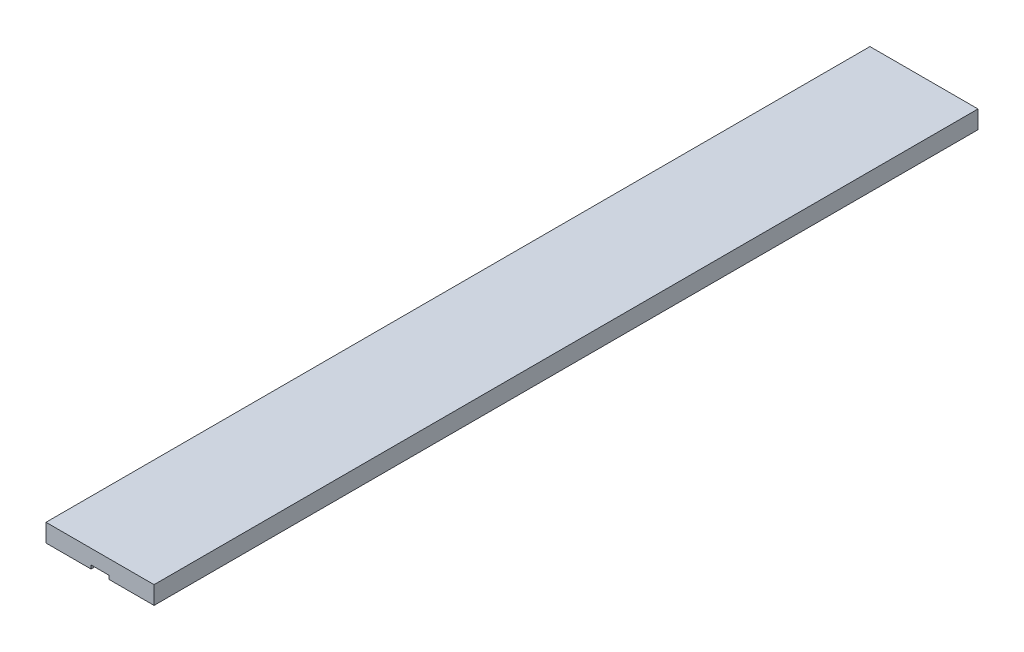
ISO-10303-21;
HEADER;
FILE_DESCRIPTION(('STEP AP214'),'2;1');
FILE_NAME('part.step','',(''),(''),'','','');
FILE_SCHEMA(('AUTOMOTIVE_DESIGN { 1 0 10303 214 1 1 1 1 }'));
ENDSEC;
DATA;
#1=APPLICATION_CONTEXT('core data for automotive mechanical design processes');
#2=APPLICATION_PROTOCOL_DEFINITION('international standard','automotive_design',2000,#1);
#3=PRODUCT_CONTEXT('',#1,'mechanical');
#4=PRODUCT('Part','Part','',(#3));
#5=PRODUCT_RELATED_PRODUCT_CATEGORY('part','',(#4));
#6=PRODUCT_DEFINITION_FORMATION('','',#4);
#7=PRODUCT_DEFINITION_CONTEXT('part definition',#1,'design');
#8=PRODUCT_DEFINITION('design','',#6,#7);
#9=PRODUCT_DEFINITION_SHAPE('','',#8);
#10=(LENGTH_UNIT() NAMED_UNIT(*) SI_UNIT(.MILLI.,.METRE.));
#11=(NAMED_UNIT(*) PLANE_ANGLE_UNIT() SI_UNIT($,.RADIAN.));
#12=(NAMED_UNIT(*) SI_UNIT($,.STERADIAN.) SOLID_ANGLE_UNIT());
#13=UNCERTAINTY_MEASURE_WITH_UNIT(LENGTH_MEASURE(1.E-05),#10,'distance_accuracy_value','');
#14=(GEOMETRIC_REPRESENTATION_CONTEXT(3) GLOBAL_UNCERTAINTY_ASSIGNED_CONTEXT((#13)) GLOBAL_UNIT_ASSIGNED_CONTEXT((#10,
#11,#12)) REPRESENTATION_CONTEXT('',''));
#15=CARTESIAN_POINT('',(0.,0.,0.));
#16=DIRECTION('',(0.,0.,1.));
#17=DIRECTION('',(1.,0.,0.));
#18=AXIS2_PLACEMENT_3D('',#15,#16,#17);
#19=CARTESIAN_POINT('',(0.,0.,0.));
#20=DIRECTION('',(0.,1.,0.));
#21=DIRECTION('',(0.,0.,1.));
#22=AXIS2_PLACEMENT_3D('',#19,#20,#21);
#23=PLANE('',#22);
#24=DIRECTION('',(-1.,0.,0.));
#25=VECTOR('',#24,1.);
#26=CARTESIAN_POINT('',(-51.9778299221959,0.,0.));
#27=LINE('',#26,#25);
#28=CARTESIAN_POINT('',(-69.4778299221959,0.,0.));
#29=VERTEX_POINT('',#28);
#30=CARTESIAN_POINT('',(-81.9778299221959,0.,0.));
#31=VERTEX_POINT('',#30);
#32=EDGE_CURVE('E139',#29,#31,#27,.T.);
#33=ORIENTED_EDGE('',*,*,#32,.F.);
#34=DIRECTION('',(0.,0.,-1.));
#35=VECTOR('',#34,1.);
#36=CARTESIAN_POINT('',(-69.4778299221959,0.,228.76));
#37=LINE('',#36,#35);
#38=CARTESIAN_POINT('',(-69.4778299221959,0.,228.76));
#39=VERTEX_POINT('',#38);
#40=EDGE_CURVE('E114',#39,#29,#37,.T.);
#41=ORIENTED_EDGE('',*,*,#40,.F.);
#42=DIRECTION('',(1.,0.,0.));
#43=VECTOR('',#42,1.);
#44=CARTESIAN_POINT('',(-81.9778299221959,0.,228.76));
#45=LINE('',#44,#43);
#46=CARTESIAN_POINT('',(-81.9778299221959,0.,228.76));
#47=VERTEX_POINT('',#46);
#48=EDGE_CURVE('E156',#47,#39,#45,.T.);
#49=ORIENTED_EDGE('',*,*,#48,.F.);
#50=DIRECTION('',(0.,0.,1.));
#51=VECTOR('',#50,1.);
#52=CARTESIAN_POINT('',(-81.9778299221959,0.,0.));
#53=LINE('',#52,#51);
#54=EDGE_CURVE('E153',#31,#47,#53,.T.);
#55=ORIENTED_EDGE('',*,*,#54,.F.);
#56=EDGE_LOOP('',(#33,#41,#49,#55));
#57=FACE_BOUND('',#56,.T.);
#58=ADVANCED_FACE('F35',(#57),#23,.F.);
#59=CARTESIAN_POINT('',(-51.9778299221959,5.,0.));
#60=DIRECTION('',(0.,0.,1.));
#61=DIRECTION('',(1.,0.,0.));
#62=AXIS2_PLACEMENT_3D('',#59,#60,#61);
#63=PLANE('',#62);
#64=DIRECTION('',(1.,0.,0.));
#65=VECTOR('',#64,1.);
#66=CARTESIAN_POINT('',(-69.4778299221959,1.,0.));
#67=LINE('',#66,#65);
#68=CARTESIAN_POINT('',(-69.4778299221959,1.,0.));
#69=VERTEX_POINT('',#68);
#70=CARTESIAN_POINT('',(-64.4778299221958,1.,0.));
#71=VERTEX_POINT('',#70);
#72=EDGE_CURVE('E124',#69,#71,#67,.T.);
#73=ORIENTED_EDGE('',*,*,#72,.F.);
#74=DIRECTION('',(0.,-1.,0.));
#75=VECTOR('',#74,1.);
#76=CARTESIAN_POINT('',(-69.4778299221959,1.,0.));
#77=LINE('',#76,#75);
#78=EDGE_CURVE('E108',#69,#29,#77,.T.);
#79=ORIENTED_EDGE('',*,*,#78,.T.);
#80=ORIENTED_EDGE('',*,*,#32,.T.);
#81=DIRECTION('',(0.,-1.,0.));
#82=VECTOR('',#81,1.);
#83=CARTESIAN_POINT('',(-81.9778299221959,5.,0.));
#84=LINE('',#83,#82);
#85=CARTESIAN_POINT('',(-81.9778299221959,5.,0.));
#86=VERTEX_POINT('',#85);
#87=EDGE_CURVE('E11',#86,#31,#84,.T.);
#88=ORIENTED_EDGE('',*,*,#87,.F.);
#89=DIRECTION('',(-1.,0.,0.));
#90=VECTOR('',#89,1.);
#91=CARTESIAN_POINT('',(-51.9778299221959,5.,0.));
#92=LINE('',#91,#90);
#93=CARTESIAN_POINT('',(-51.9778299221959,5.,0.));
#94=VERTEX_POINT('',#93);
#95=EDGE_CURVE('E144',#94,#86,#92,.T.);
#96=ORIENTED_EDGE('',*,*,#95,.F.);
#97=DIRECTION('',(0.,-1.,0.));
#98=VECTOR('',#97,1.);
#99=CARTESIAN_POINT('',(-51.9778299221959,5.,0.));
#100=LINE('',#99,#98);
#101=CARTESIAN_POINT('',(-51.9778299221959,0.,0.));
#102=VERTEX_POINT('',#101);
#103=EDGE_CURVE('E150',#94,#102,#100,.T.);
#104=ORIENTED_EDGE('',*,*,#103,.T.);
#105=CARTESIAN_POINT('',(-64.4778299221958,0.,0.));
#106=VERTEX_POINT('',#105);
#107=EDGE_CURVE('E151',#102,#106,#27,.T.);
#108=ORIENTED_EDGE('',*,*,#107,.T.);
#109=DIRECTION('',(0.,-1.,0.));
#110=VECTOR('',#109,1.);
#111=CARTESIAN_POINT('',(-64.4778299221958,1.,0.));
#112=LINE('',#111,#110);
#113=EDGE_CURVE('E50',#71,#106,#112,.T.);
#114=ORIENTED_EDGE('',*,*,#113,.F.);
#115=EDGE_LOOP('',(#73,#79,#80,#88,#96,#104,#108,#114));
#116=FACE_BOUND('',#115,.T.);
#117=ADVANCED_FACE('F37',(#116),#63,.F.);
#118=CARTESIAN_POINT('',(-81.9778299221959,5.,0.));
#119=DIRECTION('',(1.,0.,0.));
#120=DIRECTION('',(0.,0.,-1.));
#121=AXIS2_PLACEMENT_3D('',#118,#119,#120);
#122=PLANE('',#121);
#123=ORIENTED_EDGE('',*,*,#54,.T.);
#124=DIRECTION('',(0.,-1.,0.));
#125=VECTOR('',#124,1.);
#126=CARTESIAN_POINT('',(-81.9778299221959,5.,228.76));
#127=LINE('',#126,#125);
#128=CARTESIAN_POINT('',(-81.9778299221959,5.,228.76));
#129=VERTEX_POINT('',#128);
#130=EDGE_CURVE('E43',#129,#47,#127,.T.);
#131=ORIENTED_EDGE('',*,*,#130,.F.);
#132=DIRECTION('',(0.,0.,1.));
#133=VECTOR('',#132,1.);
#134=CARTESIAN_POINT('',(-81.9778299221959,5.,0.));
#135=LINE('',#134,#133);
#136=EDGE_CURVE('E87',#86,#129,#135,.T.);
#137=ORIENTED_EDGE('',*,*,#136,.F.);
#138=ORIENTED_EDGE('',*,*,#87,.T.);
#139=EDGE_LOOP('',(#123,#131,#137,#138));
#140=FACE_BOUND('',#139,.T.);
#141=ADVANCED_FACE('F172',(#140),#122,.F.);
#142=CARTESIAN_POINT('',(-81.9778299221959,5.,228.76));
#143=DIRECTION('',(0.,0.,-1.));
#144=DIRECTION('',(-1.,0.,0.));
#145=AXIS2_PLACEMENT_3D('',#142,#143,#144);
#146=PLANE('',#145);
#147=ORIENTED_EDGE('',*,*,#48,.T.);
#148=DIRECTION('',(0.,-1.,0.));
#149=VECTOR('',#148,1.);
#150=CARTESIAN_POINT('',(-69.4778299221959,1.,228.76));
#151=LINE('',#150,#149);
#152=CARTESIAN_POINT('',(-69.4778299221959,1.,228.76));
#153=VERTEX_POINT('',#152);
#154=EDGE_CURVE('E137',#153,#39,#151,.T.);
#155=ORIENTED_EDGE('',*,*,#154,.F.);
#156=DIRECTION('',(-1.,0.,0.));
#157=VECTOR('',#156,1.);
#158=CARTESIAN_POINT('',(-69.4778299221959,1.,228.76));
#159=LINE('',#158,#157);
#160=CARTESIAN_POINT('',(-64.4778299221959,1.,228.76));
#161=VERTEX_POINT('',#160);
#162=EDGE_CURVE('E118',#161,#153,#159,.T.);
#163=ORIENTED_EDGE('',*,*,#162,.F.);
#164=DIRECTION('',(0.,-1.,0.));
#165=VECTOR('',#164,1.);
#166=CARTESIAN_POINT('',(-64.4778299221959,1.,228.76));
#167=LINE('',#166,#165);
#168=CARTESIAN_POINT('',(-64.4778299221959,0.,228.76));
#169=VERTEX_POINT('',#168);
#170=EDGE_CURVE('E140',#161,#169,#167,.T.);
#171=ORIENTED_EDGE('',*,*,#170,.T.);
#172=CARTESIAN_POINT('',(-51.9778299221959,0.,228.76));
#173=VERTEX_POINT('',#172);
#174=EDGE_CURVE('E155',#169,#173,#45,.T.);
#175=ORIENTED_EDGE('',*,*,#174,.T.);
#176=DIRECTION('',(0.,-1.,0.));
#177=VECTOR('',#176,1.);
#178=CARTESIAN_POINT('',(-51.9778299221959,5.,228.76));
#179=LINE('',#178,#177);
#180=CARTESIAN_POINT('',(-51.9778299221959,5.,228.76));
#181=VERTEX_POINT('',#180);
#182=EDGE_CURVE('E161',#181,#173,#179,.T.);
#183=ORIENTED_EDGE('',*,*,#182,.F.);
#184=DIRECTION('',(1.,0.,0.));
#185=VECTOR('',#184,1.);
#186=CARTESIAN_POINT('',(-81.9778299221959,5.,228.76));
#187=LINE('',#186,#185);
#188=EDGE_CURVE('E147',#129,#181,#187,.T.);
#189=ORIENTED_EDGE('',*,*,#188,.F.);
#190=ORIENTED_EDGE('',*,*,#130,.T.);
#191=EDGE_LOOP('',(#147,#155,#163,#171,#175,#183,#189,#190));
#192=FACE_BOUND('',#191,.T.);
#193=ADVANCED_FACE('F166',(#192),#146,.F.);
#194=CARTESIAN_POINT('',(-51.9778299221959,5.,228.76));
#195=DIRECTION('',(-1.,0.,0.));
#196=DIRECTION('',(0.,0.,1.));
#197=AXIS2_PLACEMENT_3D('',#194,#195,#196);
#198=PLANE('',#197);
#199=DIRECTION('',(0.,0.,-1.));
#200=VECTOR('',#199,1.);
#201=CARTESIAN_POINT('',(-51.9778299221959,0.,228.76));
#202=LINE('',#201,#200);
#203=EDGE_CURVE('E80',#173,#102,#202,.T.);
#204=ORIENTED_EDGE('',*,*,#203,.T.);
#205=ORIENTED_EDGE('',*,*,#103,.F.);
#206=DIRECTION('',(0.,0.,-1.));
#207=VECTOR('',#206,1.);
#208=CARTESIAN_POINT('',(-51.9778299221959,5.,228.76));
#209=LINE('',#208,#207);
#210=EDGE_CURVE('E59',#181,#94,#209,.T.);
#211=ORIENTED_EDGE('',*,*,#210,.F.);
#212=ORIENTED_EDGE('',*,*,#182,.T.);
#213=EDGE_LOOP('',(#204,#205,#211,#212));
#214=FACE_BOUND('',#213,.T.);
#215=ADVANCED_FACE('F178',(#214),#198,.F.);
#216=CARTESIAN_POINT('',(0.,5.,0.));
#217=DIRECTION('',(0.,1.,0.));
#218=DIRECTION('',(0.,0.,1.));
#219=AXIS2_PLACEMENT_3D('',#216,#217,#218);
#220=PLANE('',#219);
#221=ORIENTED_EDGE('',*,*,#95,.T.);
#222=ORIENTED_EDGE('',*,*,#136,.T.);
#223=ORIENTED_EDGE('',*,*,#188,.T.);
#224=ORIENTED_EDGE('',*,*,#210,.T.);
#225=EDGE_LOOP('',(#221,#222,#223,#224));
#226=FACE_BOUND('',#225,.T.);
#227=ADVANCED_FACE('F188',(#226),#220,.T.);
#228=ORIENTED_EDGE('',*,*,#174,.F.);
#229=DIRECTION('',(0.,0.,1.));
#230=VECTOR('',#229,1.);
#231=CARTESIAN_POINT('',(-64.4778299221959,0.,228.76));
#232=LINE('',#231,#230);
#233=EDGE_CURVE('E127',#106,#169,#232,.T.);
#234=ORIENTED_EDGE('',*,*,#233,.F.);
#235=ORIENTED_EDGE('',*,*,#107,.F.);
#236=ORIENTED_EDGE('',*,*,#203,.F.);
#237=EDGE_LOOP('',(#228,#234,#235,#236));
#238=FACE_BOUND('',#237,.T.);
#239=ADVANCED_FACE('F182',(#238),#23,.F.);
#240=CARTESIAN_POINT('',(-69.4778299221959,1.,228.76));
#241=DIRECTION('',(-1.,0.,0.));
#242=DIRECTION('',(0.,0.,1.));
#243=AXIS2_PLACEMENT_3D('',#240,#241,#242);
#244=PLANE('',#243);
#245=ORIENTED_EDGE('',*,*,#40,.T.);
#246=ORIENTED_EDGE('',*,*,#78,.F.);
#247=DIRECTION('',(0.,0.,-1.));
#248=VECTOR('',#247,1.);
#249=CARTESIAN_POINT('',(-69.4778299221959,1.,228.76));
#250=LINE('',#249,#248);
#251=EDGE_CURVE('E111',#153,#69,#250,.T.);
#252=ORIENTED_EDGE('',*,*,#251,.F.);
#253=ORIENTED_EDGE('',*,*,#154,.T.);
#254=EDGE_LOOP('',(#245,#246,#252,#253));
#255=FACE_BOUND('',#254,.T.);
#256=ADVANCED_FACE('F110',(#255),#244,.F.);
#257=CARTESIAN_POINT('',(-64.4778299221959,1.,228.76));
#258=DIRECTION('',(1.,0.,0.));
#259=DIRECTION('',(0.,0.,-1.));
#260=AXIS2_PLACEMENT_3D('',#257,#258,#259);
#261=PLANE('',#260);
#262=ORIENTED_EDGE('',*,*,#233,.T.);
#263=ORIENTED_EDGE('',*,*,#170,.F.);
#264=DIRECTION('',(0.,0.,1.));
#265=VECTOR('',#264,1.);
#266=CARTESIAN_POINT('',(-64.4778299221959,1.,228.76));
#267=LINE('',#266,#265);
#268=EDGE_CURVE('E130',#71,#161,#267,.T.);
#269=ORIENTED_EDGE('',*,*,#268,.F.);
#270=ORIENTED_EDGE('',*,*,#113,.T.);
#271=EDGE_LOOP('',(#262,#263,#269,#270));
#272=FACE_BOUND('',#271,.T.);
#273=ADVANCED_FACE('F194',(#272),#261,.F.);
#274=CARTESIAN_POINT('',(0.,1.,0.));
#275=DIRECTION('',(0.,-1.,0.));
#276=DIRECTION('',(0.,0.,-1.));
#277=AXIS2_PLACEMENT_3D('',#274,#275,#276);
#278=PLANE('',#277);
#279=ORIENTED_EDGE('',*,*,#251,.T.);
#280=ORIENTED_EDGE('',*,*,#72,.T.);
#281=ORIENTED_EDGE('',*,*,#268,.T.);
#282=ORIENTED_EDGE('',*,*,#162,.T.);
#283=EDGE_LOOP('',(#279,#280,#281,#282));
#284=FACE_BOUND('',#283,.T.);
#285=ADVANCED_FACE('F122',(#284),#278,.T.);
#286=CLOSED_SHELL('',(#58,#117,#141,#193,#215,#227,#239,#256,#273,#285));
#287=MANIFOLD_SOLID_BREP('B2',#286);
#288=ADVANCED_BREP_SHAPE_REPRESENTATION('',(#18,#287),#14);
#289=SHAPE_DEFINITION_REPRESENTATION(#9,#288);
ENDSEC;
END-ISO-10303-21;
